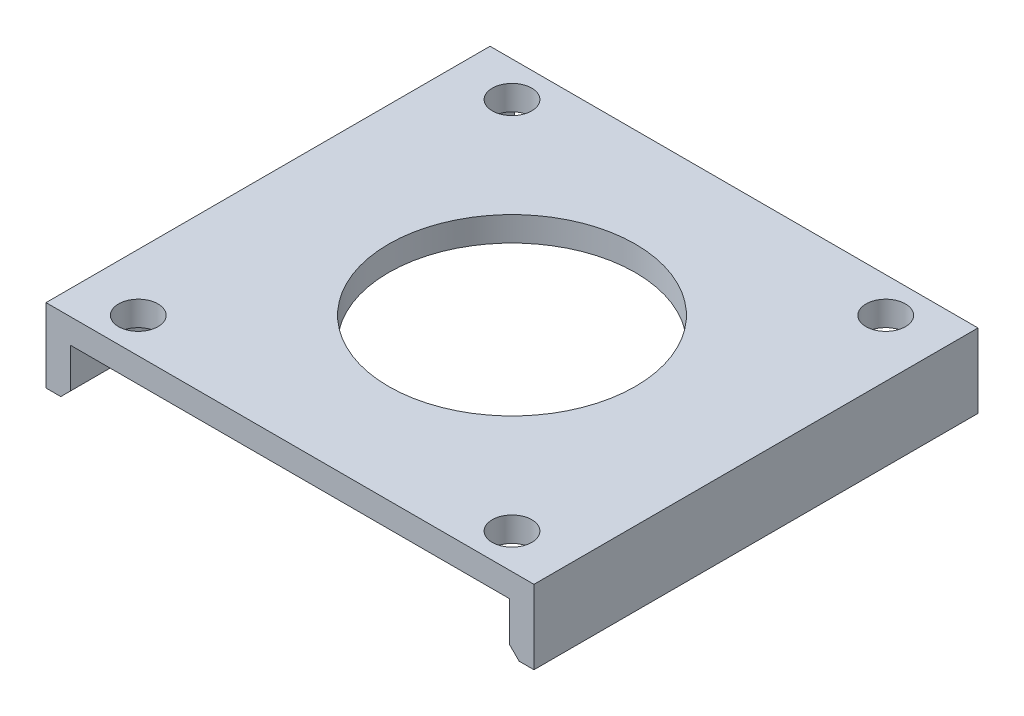
ISO-10303-21;
HEADER;
FILE_DESCRIPTION(('STEP AP214'),'2;1');
FILE_NAME('part.step','',(''),(''),'','','');
FILE_SCHEMA(('AUTOMOTIVE_DESIGN { 1 0 10303 214 1 1 1 1 }'));
ENDSEC;
DATA;
#1=APPLICATION_CONTEXT('core data for automotive mechanical design processes');
#2=APPLICATION_PROTOCOL_DEFINITION('international standard','automotive_design',2000,#1);
#3=PRODUCT_CONTEXT('',#1,'mechanical');
#4=PRODUCT('Part','Part','',(#3));
#5=PRODUCT_RELATED_PRODUCT_CATEGORY('part','',(#4));
#6=PRODUCT_DEFINITION_FORMATION('','',#4);
#7=PRODUCT_DEFINITION_CONTEXT('part definition',#1,'design');
#8=PRODUCT_DEFINITION('design','',#6,#7);
#9=PRODUCT_DEFINITION_SHAPE('','',#8);
#10=(LENGTH_UNIT() NAMED_UNIT(*) SI_UNIT(.MILLI.,.METRE.));
#11=(NAMED_UNIT(*) PLANE_ANGLE_UNIT() SI_UNIT($,.RADIAN.));
#12=(NAMED_UNIT(*) SI_UNIT($,.STERADIAN.) SOLID_ANGLE_UNIT());
#13=UNCERTAINTY_MEASURE_WITH_UNIT(LENGTH_MEASURE(1.E-05),#10,'distance_accuracy_value','');
#14=(GEOMETRIC_REPRESENTATION_CONTEXT(3) GLOBAL_UNCERTAINTY_ASSIGNED_CONTEXT((#13)) GLOBAL_UNIT_ASSIGNED_CONTEXT((#10,
#11,#12)) REPRESENTATION_CONTEXT('',''));
#15=CARTESIAN_POINT('',(0.,0.,0.));
#16=DIRECTION('',(0.,0.,1.));
#17=DIRECTION('',(1.,0.,0.));
#18=AXIS2_PLACEMENT_3D('',#15,#16,#17);
#19=CARTESIAN_POINT('',(0.,0.,0.));
#20=DIRECTION('',(0.,1.,0.));
#21=DIRECTION('',(0.,0.,1.));
#22=AXIS2_PLACEMENT_3D('',#19,#20,#21);
#23=PLANE('',#22);
#24=CARTESIAN_POINT('',(37.875,0.,37.875));
#25=DIRECTION('',(0.,1.,0.));
#26=DIRECTION('',(0.,0.,1.));
#27=AXIS2_PLACEMENT_3D('',#24,#25,#26);
#28=CIRCLE('',#27,4.00000000000001);
#29=CARTESIAN_POINT('',(37.875,0.,41.875));
#30=VERTEX_POINT('',#29);
#31=EDGE_CURVE('E154',#30,#30,#28,.T.);
#32=ORIENTED_EDGE('',*,*,#31,.T.);
#33=EDGE_LOOP('',(#32));
#34=FACE_BOUND('',#33,.T.);
#35=CARTESIAN_POINT('',(-37.875,0.,37.875));
#36=DIRECTION('',(0.,1.,0.));
#37=DIRECTION('',(0.,0.,1.));
#38=AXIS2_PLACEMENT_3D('',#35,#36,#37);
#39=CIRCLE('',#38,4.);
#40=CARTESIAN_POINT('',(-37.875,0.,41.875));
#41=VERTEX_POINT('',#40);
#42=EDGE_CURVE('E195',#41,#41,#39,.T.);
#43=ORIENTED_EDGE('',*,*,#42,.T.);
#44=EDGE_LOOP('',(#43));
#45=FACE_BOUND('',#44,.T.);
#46=CARTESIAN_POINT('',(37.875,0.,-37.875));
#47=DIRECTION('',(0.,1.,0.));
#48=DIRECTION('',(0.,0.,1.));
#49=AXIS2_PLACEMENT_3D('',#46,#47,#48);
#50=CIRCLE('',#49,4.00000000000001);
#51=CARTESIAN_POINT('',(37.875,0.,-33.875));
#52=VERTEX_POINT('',#51);
#53=EDGE_CURVE('E198',#52,#52,#50,.T.);
#54=ORIENTED_EDGE('',*,*,#53,.T.);
#55=EDGE_LOOP('',(#54));
#56=FACE_BOUND('',#55,.T.);
#57=CARTESIAN_POINT('',(-37.875,0.,-37.875));
#58=DIRECTION('',(0.,1.,0.));
#59=DIRECTION('',(0.,0.,1.));
#60=AXIS2_PLACEMENT_3D('',#57,#58,#59);
#61=CIRCLE('',#60,4.00000000000001);
#62=CARTESIAN_POINT('',(-37.875,0.,-33.875));
#63=VERTEX_POINT('',#62);
#64=EDGE_CURVE('E201',#63,#63,#61,.T.);
#65=ORIENTED_EDGE('',*,*,#64,.T.);
#66=EDGE_LOOP('',(#65));
#67=FACE_BOUND('',#66,.T.);
#68=CARTESIAN_POINT('',(0.,0.,0.));
#69=DIRECTION('',(0.,1.,0.));
#70=DIRECTION('',(0.,0.,1.));
#71=AXIS2_PLACEMENT_3D('',#68,#69,#70);
#72=CIRCLE('',#71,25.);
#73=CARTESIAN_POINT('',(0.,0.,25.));
#74=VERTEX_POINT('',#73);
#75=EDGE_CURVE('E204',#74,#74,#72,.T.);
#76=ORIENTED_EDGE('',*,*,#75,.T.);
#77=EDGE_LOOP('',(#76));
#78=FACE_BOUND('',#77,.T.);
#79=DIRECTION('',(0.,0.,1.));
#80=VECTOR('',#79,1.);
#81=CARTESIAN_POINT('',(-44.45,0.,45.));
#82=LINE('',#81,#80);
#83=CARTESIAN_POINT('',(-44.45,0.,-45.));
#84=VERTEX_POINT('',#83);
#85=CARTESIAN_POINT('',(-44.45,0.,45.));
#86=VERTEX_POINT('',#85);
#87=EDGE_CURVE('E143',#84,#86,#82,.T.);
#88=ORIENTED_EDGE('',*,*,#87,.F.);
#89=DIRECTION('',(1.,0.,0.));
#90=VECTOR('',#89,1.);
#91=CARTESIAN_POINT('',(0.,0.,-45.));
#92=LINE('',#91,#90);
#93=CARTESIAN_POINT('',(44.45,0.,-45.));
#94=VERTEX_POINT('',#93);
#95=EDGE_CURVE('E173',#84,#94,#92,.T.);
#96=ORIENTED_EDGE('',*,*,#95,.T.);
#97=DIRECTION('',(0.,0.,-1.));
#98=VECTOR('',#97,1.);
#99=CARTESIAN_POINT('',(44.45,0.,45.));
#100=LINE('',#99,#98);
#101=CARTESIAN_POINT('',(44.45,0.,45.));
#102=VERTEX_POINT('',#101);
#103=EDGE_CURVE('E146',#102,#94,#100,.T.);
#104=ORIENTED_EDGE('',*,*,#103,.F.);
#105=DIRECTION('',(1.,0.,0.));
#106=VECTOR('',#105,1.);
#107=CARTESIAN_POINT('',(0.,0.,45.));
#108=LINE('',#107,#106);
#109=EDGE_CURVE('E207',#86,#102,#108,.T.);
#110=ORIENTED_EDGE('',*,*,#109,.F.);
#111=EDGE_LOOP('',(#88,#96,#104,#110));
#112=FACE_BOUND('',#111,.T.);
#113=ADVANCED_FACE('F41',(#34,#45,#56,#67,#78,#112),#23,.F.);
#114=CARTESIAN_POINT('',(0.,5.,45.));
#115=DIRECTION('',(0.,0.,-1.));
#116=DIRECTION('',(-1.,0.,0.));
#117=AXIS2_PLACEMENT_3D('',#114,#115,#116);
#118=PLANE('',#117);
#119=DIRECTION('',(0.,1.,0.));
#120=VECTOR('',#119,1.);
#121=CARTESIAN_POINT('',(44.45,-10.,45.));
#122=LINE('',#121,#120);
#123=CARTESIAN_POINT('',(44.45,-8.00000000000003,45.));
#124=VERTEX_POINT('',#123);
#125=EDGE_CURVE('E155',#124,#102,#122,.T.);
#126=ORIENTED_EDGE('',*,*,#125,.F.);
#127=DIRECTION('',(-0.707106781186547,0.707106781186548,0.));
#128=VECTOR('',#127,1.);
#129=CARTESIAN_POINT('',(46.45,-10.,45.));
#130=LINE('',#129,#128);
#131=CARTESIAN_POINT('',(46.45,-10.,45.));
#132=VERTEX_POINT('',#131);
#133=EDGE_CURVE('E226',#124,#132,#130,.F.);
#134=ORIENTED_EDGE('',*,*,#133,.T.);
#135=DIRECTION('',(-1.,0.,0.));
#136=VECTOR('',#135,1.);
#137=CARTESIAN_POINT('',(49.45,-10.,45.));
#138=LINE('',#137,#136);
#139=CARTESIAN_POINT('',(49.45,-10.,45.));
#140=VERTEX_POINT('',#139);
#141=EDGE_CURVE('E164',#140,#132,#138,.T.);
#142=ORIENTED_EDGE('',*,*,#141,.F.);
#143=DIRECTION('',(0.,-1.,0.));
#144=VECTOR('',#143,1.);
#145=CARTESIAN_POINT('',(49.45,5.,45.));
#146=LINE('',#145,#144);
#147=CARTESIAN_POINT('',(49.45,5.,45.));
#148=VERTEX_POINT('',#147);
#149=EDGE_CURVE('E215',#148,#140,#146,.T.);
#150=ORIENTED_EDGE('',*,*,#149,.F.);
#151=DIRECTION('',(1.,0.,0.));
#152=VECTOR('',#151,1.);
#153=CARTESIAN_POINT('',(0.,5.,45.));
#154=LINE('',#153,#152);
#155=CARTESIAN_POINT('',(-49.45,5.,45.));
#156=VERTEX_POINT('',#155);
#157=EDGE_CURVE('E185',#156,#148,#154,.T.);
#158=ORIENTED_EDGE('',*,*,#157,.F.);
#159=DIRECTION('',(0.,-1.,0.));
#160=VECTOR('',#159,1.);
#161=CARTESIAN_POINT('',(-49.45,5.,45.));
#162=LINE('',#161,#160);
#163=CARTESIAN_POINT('',(-49.45,-10.,45.));
#164=VERTEX_POINT('',#163);
#165=EDGE_CURVE('E129',#156,#164,#162,.T.);
#166=ORIENTED_EDGE('',*,*,#165,.T.);
#167=DIRECTION('',(-1.,0.,0.));
#168=VECTOR('',#167,1.);
#169=CARTESIAN_POINT('',(-49.45,-10.,45.));
#170=LINE('',#169,#168);
#171=CARTESIAN_POINT('',(-46.45,-10.,45.));
#172=VERTEX_POINT('',#171);
#173=EDGE_CURVE('E139',#172,#164,#170,.T.);
#174=ORIENTED_EDGE('',*,*,#173,.F.);
#175=DIRECTION('',(0.707106781186548,0.707106781186548,0.));
#176=VECTOR('',#175,1.);
#177=CARTESIAN_POINT('',(-46.45,-10.,45.));
#178=LINE('',#177,#176);
#179=CARTESIAN_POINT('',(-44.45,-8.00000000000003,45.));
#180=VERTEX_POINT('',#179);
#181=EDGE_CURVE('E57',#172,#180,#178,.T.);
#182=ORIENTED_EDGE('',*,*,#181,.T.);
#183=DIRECTION('',(0.,1.,0.));
#184=VECTOR('',#183,1.);
#185=CARTESIAN_POINT('',(-44.45,-10.,45.));
#186=LINE('',#185,#184);
#187=EDGE_CURVE('E149',#180,#86,#186,.T.);
#188=ORIENTED_EDGE('',*,*,#187,.T.);
#189=ORIENTED_EDGE('',*,*,#109,.T.);
#190=EDGE_LOOP('',(#126,#134,#142,#150,#158,#166,#174,#182,#188,#189));
#191=FACE_BOUND('',#190,.T.);
#192=ADVANCED_FACE('F228',(#191),#118,.F.);
#193=CARTESIAN_POINT('',(49.45,5.,0.));
#194=DIRECTION('',(-1.,0.,0.));
#195=DIRECTION('',(0.,0.,1.));
#196=AXIS2_PLACEMENT_3D('',#193,#194,#195);
#197=PLANE('',#196);
#198=ORIENTED_EDGE('',*,*,#149,.T.);
#199=DIRECTION('',(0.,0.,1.));
#200=VECTOR('',#199,1.);
#201=CARTESIAN_POINT('',(49.45,-10.,45.));
#202=LINE('',#201,#200);
#203=CARTESIAN_POINT('',(49.45,-10.,-45.));
#204=VERTEX_POINT('',#203);
#205=EDGE_CURVE('E162',#204,#140,#202,.T.);
#206=ORIENTED_EDGE('',*,*,#205,.F.);
#207=DIRECTION('',(0.,-1.,0.));
#208=VECTOR('',#207,1.);
#209=CARTESIAN_POINT('',(49.45,5.,-45.));
#210=LINE('',#209,#208);
#211=CARTESIAN_POINT('',(49.45,5.,-45.));
#212=VERTEX_POINT('',#211);
#213=EDGE_CURVE('E128',#212,#204,#210,.T.);
#214=ORIENTED_EDGE('',*,*,#213,.F.);
#215=DIRECTION('',(0.,0.,-1.));
#216=VECTOR('',#215,1.);
#217=CARTESIAN_POINT('',(49.45,5.,0.));
#218=LINE('',#217,#216);
#219=EDGE_CURVE('E188',#148,#212,#218,.T.);
#220=ORIENTED_EDGE('',*,*,#219,.F.);
#221=EDGE_LOOP('',(#198,#206,#214,#220));
#222=FACE_BOUND('',#221,.T.);
#223=ADVANCED_FACE('F237',(#222),#197,.F.);
#224=CARTESIAN_POINT('',(0.,5.,-45.));
#225=DIRECTION('',(0.,0.,-1.));
#226=DIRECTION('',(-1.,0.,0.));
#227=AXIS2_PLACEMENT_3D('',#224,#225,#226);
#228=PLANE('',#227);
#229=DIRECTION('',(1.,0.,0.));
#230=VECTOR('',#229,1.);
#231=CARTESIAN_POINT('',(49.45,-10.,-45.));
#232=LINE('',#231,#230);
#233=CARTESIAN_POINT('',(46.45,-10.,-45.));
#234=VERTEX_POINT('',#233);
#235=EDGE_CURVE('E159',#234,#204,#232,.T.);
#236=ORIENTED_EDGE('',*,*,#235,.F.);
#237=DIRECTION('',(0.707106781186547,-0.707106781186548,0.));
#238=VECTOR('',#237,1.);
#239=CARTESIAN_POINT('',(15.725,20.725,-45.));
#240=LINE('',#239,#238);
#241=CARTESIAN_POINT('',(44.45,-8.00000000000003,-45.));
#242=VERTEX_POINT('',#241);
#243=EDGE_CURVE('E221',#234,#242,#240,.F.);
#244=ORIENTED_EDGE('',*,*,#243,.T.);
#245=DIRECTION('',(0.,1.,0.));
#246=VECTOR('',#245,1.);
#247=CARTESIAN_POINT('',(44.45,-10.,-45.));
#248=LINE('',#247,#246);
#249=EDGE_CURVE('E157',#242,#94,#248,.T.);
#250=ORIENTED_EDGE('',*,*,#249,.T.);
#251=ORIENTED_EDGE('',*,*,#95,.F.);
#252=DIRECTION('',(0.,1.,0.));
#253=VECTOR('',#252,1.);
#254=CARTESIAN_POINT('',(-44.45,-10.,-45.));
#255=LINE('',#254,#253);
#256=CARTESIAN_POINT('',(-44.45,-8.00000000000003,-45.));
#257=VERTEX_POINT('',#256);
#258=EDGE_CURVE('E152',#257,#84,#255,.T.);
#259=ORIENTED_EDGE('',*,*,#258,.F.);
#260=DIRECTION('',(-0.707106781186548,-0.707106781186548,0.));
#261=VECTOR('',#260,1.);
#262=CARTESIAN_POINT('',(-15.725,20.725,-45.));
#263=LINE('',#262,#261);
#264=CARTESIAN_POINT('',(-46.45,-10.,-45.));
#265=VERTEX_POINT('',#264);
#266=EDGE_CURVE('E137',#257,#265,#263,.T.);
#267=ORIENTED_EDGE('',*,*,#266,.T.);
#268=DIRECTION('',(1.,0.,0.));
#269=VECTOR('',#268,1.);
#270=CARTESIAN_POINT('',(-49.45,-10.,-45.));
#271=LINE('',#270,#269);
#272=CARTESIAN_POINT('',(-49.45,-10.,-45.));
#273=VERTEX_POINT('',#272);
#274=EDGE_CURVE('E132',#273,#265,#271,.T.);
#275=ORIENTED_EDGE('',*,*,#274,.F.);
#276=DIRECTION('',(0.,-1.,0.));
#277=VECTOR('',#276,1.);
#278=CARTESIAN_POINT('',(-49.45,5.,-45.));
#279=LINE('',#278,#277);
#280=CARTESIAN_POINT('',(-49.45,5.,-45.));
#281=VERTEX_POINT('',#280);
#282=EDGE_CURVE('E118',#281,#273,#279,.T.);
#283=ORIENTED_EDGE('',*,*,#282,.F.);
#284=DIRECTION('',(1.,0.,0.));
#285=VECTOR('',#284,1.);
#286=CARTESIAN_POINT('',(0.,5.,-45.));
#287=LINE('',#286,#285);
#288=EDGE_CURVE('E190',#281,#212,#287,.T.);
#289=ORIENTED_EDGE('',*,*,#288,.T.);
#290=ORIENTED_EDGE('',*,*,#213,.T.);
#291=EDGE_LOOP('',(#236,#244,#250,#251,#259,#267,#275,#283,#289,#290));
#292=FACE_BOUND('',#291,.T.);
#293=ADVANCED_FACE('F134',(#292),#228,.T.);
#294=CARTESIAN_POINT('',(0.,5.,0.));
#295=DIRECTION('',(0.,-1.,0.));
#296=DIRECTION('',(0.,0.,-1.));
#297=AXIS2_PLACEMENT_3D('',#294,#295,#296);
#298=CYLINDRICAL_SURFACE('',#297,25.);
#299=CARTESIAN_POINT('',(0.,5.,0.));
#300=DIRECTION('',(0.,1.,0.));
#301=DIRECTION('',(0.,0.,1.));
#302=AXIS2_PLACEMENT_3D('',#299,#300,#301);
#303=CIRCLE('',#302,25.);
#304=CARTESIAN_POINT('',(0.,5.,25.));
#305=VERTEX_POINT('',#304);
#306=EDGE_CURVE('E182',#305,#305,#303,.T.);
#307=ORIENTED_EDGE('',*,*,#306,.T.);
#308=EDGE_LOOP('',(#307));
#309=FACE_BOUND('',#308,.T.);
#310=ORIENTED_EDGE('',*,*,#75,.F.);
#311=EDGE_LOOP('',(#310));
#312=FACE_BOUND('',#311,.T.);
#313=ADVANCED_FACE('F277',(#309,#312),#298,.F.);
#314=CARTESIAN_POINT('',(-37.875,5.,-37.875));
#315=DIRECTION('',(0.,-1.,0.));
#316=DIRECTION('',(0.,0.,-1.));
#317=AXIS2_PLACEMENT_3D('',#314,#315,#316);
#318=CYLINDRICAL_SURFACE('',#317,4.00000000000001);
#319=CARTESIAN_POINT('',(-37.875,5.,-37.875));
#320=DIRECTION('',(0.,1.,0.));
#321=DIRECTION('',(0.,0.,1.));
#322=AXIS2_PLACEMENT_3D('',#319,#320,#321);
#323=CIRCLE('',#322,4.00000000000001);
#324=CARTESIAN_POINT('',(-37.875,5.,-33.875));
#325=VERTEX_POINT('',#324);
#326=EDGE_CURVE('E179',#325,#325,#323,.T.);
#327=ORIENTED_EDGE('',*,*,#326,.T.);
#328=EDGE_LOOP('',(#327));
#329=FACE_BOUND('',#328,.T.);
#330=ORIENTED_EDGE('',*,*,#64,.F.);
#331=EDGE_LOOP('',(#330));
#332=FACE_BOUND('',#331,.T.);
#333=ADVANCED_FACE('F281',(#329,#332),#318,.F.);
#334=CARTESIAN_POINT('',(37.875,5.,-37.875));
#335=DIRECTION('',(0.,-1.,0.));
#336=DIRECTION('',(0.,0.,-1.));
#337=AXIS2_PLACEMENT_3D('',#334,#335,#336);
#338=CYLINDRICAL_SURFACE('',#337,4.00000000000001);
#339=CARTESIAN_POINT('',(37.875,5.,-37.875));
#340=DIRECTION('',(0.,1.,0.));
#341=DIRECTION('',(0.,0.,1.));
#342=AXIS2_PLACEMENT_3D('',#339,#340,#341);
#343=CIRCLE('',#342,4.00000000000001);
#344=CARTESIAN_POINT('',(37.875,5.,-33.875));
#345=VERTEX_POINT('',#344);
#346=EDGE_CURVE('E176',#345,#345,#343,.T.);
#347=ORIENTED_EDGE('',*,*,#346,.T.);
#348=EDGE_LOOP('',(#347));
#349=FACE_BOUND('',#348,.T.);
#350=ORIENTED_EDGE('',*,*,#53,.F.);
#351=EDGE_LOOP('',(#350));
#352=FACE_BOUND('',#351,.T.);
#353=ADVANCED_FACE('F285',(#349,#352),#338,.F.);
#354=CARTESIAN_POINT('',(-37.875,5.,37.875));
#355=DIRECTION('',(0.,-1.,0.));
#356=DIRECTION('',(0.,0.,-1.));
#357=AXIS2_PLACEMENT_3D('',#354,#355,#356);
#358=CYLINDRICAL_SURFACE('',#357,4.);
#359=CARTESIAN_POINT('',(-37.875,5.,37.875));
#360=DIRECTION('',(0.,1.,0.));
#361=DIRECTION('',(0.,0.,1.));
#362=AXIS2_PLACEMENT_3D('',#359,#360,#361);
#363=CIRCLE('',#362,4.);
#364=CARTESIAN_POINT('',(-37.875,5.,41.875));
#365=VERTEX_POINT('',#364);
#366=EDGE_CURVE('E172',#365,#365,#363,.T.);
#367=ORIENTED_EDGE('',*,*,#366,.T.);
#368=EDGE_LOOP('',(#367));
#369=FACE_BOUND('',#368,.T.);
#370=ORIENTED_EDGE('',*,*,#42,.F.);
#371=EDGE_LOOP('',(#370));
#372=FACE_BOUND('',#371,.T.);
#373=ADVANCED_FACE('F289',(#369,#372),#358,.F.);
#374=CARTESIAN_POINT('',(37.875,5.,37.875));
#375=DIRECTION('',(0.,-1.,0.));
#376=DIRECTION('',(0.,0.,-1.));
#377=AXIS2_PLACEMENT_3D('',#374,#375,#376);
#378=CYLINDRICAL_SURFACE('',#377,4.00000000000001);
#379=CARTESIAN_POINT('',(37.875,5.,37.875));
#380=DIRECTION('',(0.,1.,0.));
#381=DIRECTION('',(0.,0.,1.));
#382=AXIS2_PLACEMENT_3D('',#379,#380,#381);
#383=CIRCLE('',#382,4.00000000000001);
#384=CARTESIAN_POINT('',(37.875,5.,41.875));
#385=VERTEX_POINT('',#384);
#386=EDGE_CURVE('E169',#385,#385,#383,.T.);
#387=ORIENTED_EDGE('',*,*,#386,.T.);
#388=EDGE_LOOP('',(#387));
#389=FACE_BOUND('',#388,.T.);
#390=ORIENTED_EDGE('',*,*,#31,.F.);
#391=EDGE_LOOP('',(#390));
#392=FACE_BOUND('',#391,.T.);
#393=ADVANCED_FACE('F274',(#389,#392),#378,.F.);
#394=CARTESIAN_POINT('',(-49.45,5.,0.));
#395=DIRECTION('',(-1.,0.,0.));
#396=DIRECTION('',(0.,0.,1.));
#397=AXIS2_PLACEMENT_3D('',#394,#395,#396);
#398=PLANE('',#397);
#399=ORIENTED_EDGE('',*,*,#282,.T.);
#400=DIRECTION('',(0.,0.,-1.));
#401=VECTOR('',#400,1.);
#402=CARTESIAN_POINT('',(-49.45,-10.,45.));
#403=LINE('',#402,#401);
#404=EDGE_CURVE('E122',#164,#273,#403,.T.);
#405=ORIENTED_EDGE('',*,*,#404,.F.);
#406=ORIENTED_EDGE('',*,*,#165,.F.);
#407=DIRECTION('',(0.,0.,-1.));
#408=VECTOR('',#407,1.);
#409=CARTESIAN_POINT('',(-49.45,5.,0.));
#410=LINE('',#409,#408);
#411=EDGE_CURVE('E124',#156,#281,#410,.T.);
#412=ORIENTED_EDGE('',*,*,#411,.T.);
#413=EDGE_LOOP('',(#399,#405,#406,#412));
#414=FACE_BOUND('',#413,.T.);
#415=ADVANCED_FACE('F120',(#414),#398,.T.);
#416=CARTESIAN_POINT('',(0.,5.,0.));
#417=DIRECTION('',(0.,1.,0.));
#418=DIRECTION('',(0.,0.,1.));
#419=AXIS2_PLACEMENT_3D('',#416,#417,#418);
#420=PLANE('',#419);
#421=ORIENTED_EDGE('',*,*,#386,.F.);
#422=EDGE_LOOP('',(#421));
#423=FACE_BOUND('',#422,.T.);
#424=ORIENTED_EDGE('',*,*,#366,.F.);
#425=EDGE_LOOP('',(#424));
#426=FACE_BOUND('',#425,.T.);
#427=ORIENTED_EDGE('',*,*,#346,.F.);
#428=EDGE_LOOP('',(#427));
#429=FACE_BOUND('',#428,.T.);
#430=ORIENTED_EDGE('',*,*,#326,.F.);
#431=EDGE_LOOP('',(#430));
#432=FACE_BOUND('',#431,.T.);
#433=ORIENTED_EDGE('',*,*,#306,.F.);
#434=EDGE_LOOP('',(#433));
#435=FACE_BOUND('',#434,.T.);
#436=ORIENTED_EDGE('',*,*,#157,.T.);
#437=ORIENTED_EDGE('',*,*,#219,.T.);
#438=ORIENTED_EDGE('',*,*,#288,.F.);
#439=ORIENTED_EDGE('',*,*,#411,.F.);
#440=EDGE_LOOP('',(#436,#437,#438,#439));
#441=FACE_BOUND('',#440,.T.);
#442=ADVANCED_FACE('F233',(#423,#426,#429,#432,#435,#441),#420,.T.);
#443=CARTESIAN_POINT('',(44.45,-10.,45.));
#444=DIRECTION('',(1.,0.,0.));
#445=DIRECTION('',(0.,0.,-1.));
#446=AXIS2_PLACEMENT_3D('',#443,#444,#445);
#447=PLANE('',#446);
#448=ORIENTED_EDGE('',*,*,#249,.F.);
#449=DIRECTION('',(0.,0.,1.));
#450=VECTOR('',#449,1.);
#451=CARTESIAN_POINT('',(44.45,-8.00000000000003,45.));
#452=LINE('',#451,#450);
#453=EDGE_CURVE('E223',#242,#124,#452,.T.);
#454=ORIENTED_EDGE('',*,*,#453,.T.);
#455=ORIENTED_EDGE('',*,*,#125,.T.);
#456=ORIENTED_EDGE('',*,*,#103,.T.);
#457=EDGE_LOOP('',(#448,#454,#455,#456));
#458=FACE_BOUND('',#457,.T.);
#459=ADVANCED_FACE('F248',(#458),#447,.F.);
#460=CARTESIAN_POINT('',(0.,-10.,0.));
#461=DIRECTION('',(0.,1.,0.));
#462=DIRECTION('',(0.,0.,1.));
#463=AXIS2_PLACEMENT_3D('',#460,#461,#462);
#464=PLANE('',#463);
#465=ORIENTED_EDGE('',*,*,#141,.T.);
#466=DIRECTION('',(0.,0.,-1.));
#467=VECTOR('',#466,1.);
#468=CARTESIAN_POINT('',(46.45,-10.,0.));
#469=LINE('',#468,#467);
#470=EDGE_CURVE('E217',#132,#234,#469,.T.);
#471=ORIENTED_EDGE('',*,*,#470,.T.);
#472=ORIENTED_EDGE('',*,*,#235,.T.);
#473=ORIENTED_EDGE('',*,*,#205,.T.);
#474=EDGE_LOOP('',(#465,#471,#472,#473));
#475=FACE_BOUND('',#474,.T.);
#476=ADVANCED_FACE('F239',(#475),#464,.F.);
#477=CARTESIAN_POINT('',(-44.45,-10.,45.));
#478=DIRECTION('',(-1.,0.,0.));
#479=DIRECTION('',(0.,0.,1.));
#480=AXIS2_PLACEMENT_3D('',#477,#478,#479);
#481=PLANE('',#480);
#482=ORIENTED_EDGE('',*,*,#187,.F.);
#483=DIRECTION('',(0.,0.,-1.));
#484=VECTOR('',#483,1.);
#485=CARTESIAN_POINT('',(-44.45,-8.00000000000003,-45.));
#486=LINE('',#485,#484);
#487=EDGE_CURVE('E11',#180,#257,#486,.T.);
#488=ORIENTED_EDGE('',*,*,#487,.T.);
#489=ORIENTED_EDGE('',*,*,#258,.T.);
#490=ORIENTED_EDGE('',*,*,#87,.T.);
#491=EDGE_LOOP('',(#482,#488,#489,#490));
#492=FACE_BOUND('',#491,.T.);
#493=ADVANCED_FACE('F254',(#492),#481,.F.);
#494=CARTESIAN_POINT('',(0.,-10.,0.));
#495=DIRECTION('',(0.,-1.,0.));
#496=DIRECTION('',(0.,0.,-1.));
#497=AXIS2_PLACEMENT_3D('',#494,#495,#496);
#498=PLANE('',#497);
#499=ORIENTED_EDGE('',*,*,#274,.T.);
#500=DIRECTION('',(0.,0.,1.));
#501=VECTOR('',#500,1.);
#502=CARTESIAN_POINT('',(-46.45,-10.,45.));
#503=LINE('',#502,#501);
#504=EDGE_CURVE('E50',#265,#172,#503,.T.);
#505=ORIENTED_EDGE('',*,*,#504,.T.);
#506=ORIENTED_EDGE('',*,*,#173,.T.);
#507=ORIENTED_EDGE('',*,*,#404,.T.);
#508=EDGE_LOOP('',(#499,#505,#506,#507));
#509=FACE_BOUND('',#508,.T.);
#510=ADVANCED_FACE('F141',(#509),#498,.T.);
#511=CARTESIAN_POINT('',(46.45,-10.,0.));
#512=DIRECTION('',(0.707106781186548,0.707106781186547,0.));
#513=DIRECTION('',(0.,0.,-1.));
#514=AXIS2_PLACEMENT_3D('',#511,#512,#513);
#515=PLANE('',#514);
#516=ORIENTED_EDGE('',*,*,#133,.F.);
#517=ORIENTED_EDGE('',*,*,#453,.F.);
#518=ORIENTED_EDGE('',*,*,#243,.F.);
#519=ORIENTED_EDGE('',*,*,#470,.F.);
#520=EDGE_LOOP('',(#516,#517,#518,#519));
#521=FACE_BOUND('',#520,.T.);
#522=ADVANCED_FACE('F243',(#521),#515,.F.);
#523=CARTESIAN_POINT('',(-46.45,-10.,0.));
#524=DIRECTION('',(0.707106781186547,-0.707106781186547,0.));
#525=DIRECTION('',(0.,0.,-1.));
#526=AXIS2_PLACEMENT_3D('',#523,#524,#525);
#527=PLANE('',#526);
#528=ORIENTED_EDGE('',*,*,#266,.F.);
#529=ORIENTED_EDGE('',*,*,#487,.F.);
#530=ORIENTED_EDGE('',*,*,#181,.F.);
#531=ORIENTED_EDGE('',*,*,#504,.F.);
#532=EDGE_LOOP('',(#528,#529,#530,#531));
#533=FACE_BOUND('',#532,.T.);
#534=ADVANCED_FACE('F44',(#533),#527,.T.);
#535=CLOSED_SHELL('',(#113,#192,#223,#293,#313,#333,#353,#373,#393,#415,#442,#459,#476,#493,
#510,#522,#534));
#536=MANIFOLD_SOLID_BREP('B2',#535);
#537=ADVANCED_BREP_SHAPE_REPRESENTATION('',(#18,#536),#14);
#538=SHAPE_DEFINITION_REPRESENTATION(#9,#537);
ENDSEC;
END-ISO-10303-21;
